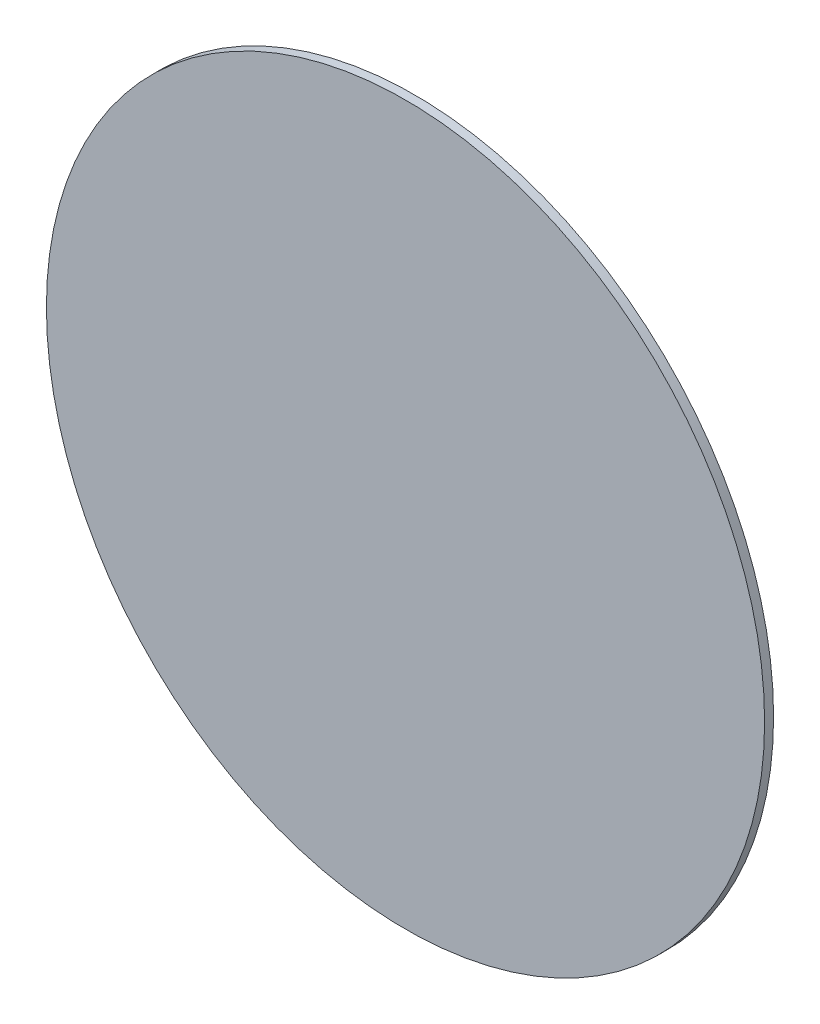
ISO-10303-21;
HEADER;
FILE_DESCRIPTION(('STEP AP214'),'2;1');
FILE_NAME('part.step','',(''),(''),'','','');
FILE_SCHEMA(('AUTOMOTIVE_DESIGN { 1 0 10303 214 1 1 1 1 }'));
ENDSEC;
DATA;
#1=APPLICATION_CONTEXT('core data for automotive mechanical design processes');
#2=APPLICATION_PROTOCOL_DEFINITION('international standard','automotive_design',2000,#1);
#3=PRODUCT_CONTEXT('',#1,'mechanical');
#4=PRODUCT('Part','Part','',(#3));
#5=PRODUCT_RELATED_PRODUCT_CATEGORY('part','',(#4));
#6=PRODUCT_DEFINITION_FORMATION('','',#4);
#7=PRODUCT_DEFINITION_CONTEXT('part definition',#1,'design');
#8=PRODUCT_DEFINITION('design','',#6,#7);
#9=PRODUCT_DEFINITION_SHAPE('','',#8);
#10=(LENGTH_UNIT() NAMED_UNIT(*) SI_UNIT(.MILLI.,.METRE.));
#11=(NAMED_UNIT(*) PLANE_ANGLE_UNIT() SI_UNIT($,.RADIAN.));
#12=(NAMED_UNIT(*) SI_UNIT($,.STERADIAN.) SOLID_ANGLE_UNIT());
#13=UNCERTAINTY_MEASURE_WITH_UNIT(LENGTH_MEASURE(1.E-05),#10,'distance_accuracy_value','');
#14=(GEOMETRIC_REPRESENTATION_CONTEXT(3) GLOBAL_UNCERTAINTY_ASSIGNED_CONTEXT((#13)) GLOBAL_UNIT_ASSIGNED_CONTEXT((#10,
#11,#12)) REPRESENTATION_CONTEXT('',''));
#15=CARTESIAN_POINT('',(0.,0.,0.));
#16=DIRECTION('',(0.,0.,1.));
#17=DIRECTION('',(1.,0.,0.));
#18=AXIS2_PLACEMENT_3D('',#15,#16,#17);
#19=CARTESIAN_POINT('',(0.,0.,0.5));
#20=DIRECTION('',(0.,0.,-1.));
#21=DIRECTION('',(-1.,0.,0.));
#22=AXIS2_PLACEMENT_3D('',#19,#20,#21);
#23=CYLINDRICAL_SURFACE('',#22,20.);
#24=CARTESIAN_POINT('',(0.,0.,0.5));
#25=DIRECTION('',(0.,0.,1.));
#26=DIRECTION('',(1.,0.,0.));
#27=AXIS2_PLACEMENT_3D('',#24,#25,#26);
#28=CIRCLE('',#27,20.);
#29=CARTESIAN_POINT('',(20.,0.,0.5));
#30=VERTEX_POINT('',#29);
#31=EDGE_CURVE('E10',#30,#30,#28,.T.);
#32=ORIENTED_EDGE('',*,*,#31,.F.);
#33=EDGE_LOOP('',(#32));
#34=FACE_BOUND('',#33,.T.);
#35=CARTESIAN_POINT('',(0.,0.,0.));
#36=DIRECTION('',(0.,0.,1.));
#37=DIRECTION('',(1.,0.,0.));
#38=AXIS2_PLACEMENT_3D('',#35,#36,#37);
#39=CIRCLE('',#38,20.);
#40=CARTESIAN_POINT('',(20.,0.,0.));
#41=VERTEX_POINT('',#40);
#42=EDGE_CURVE('E39',#41,#41,#39,.T.);
#43=ORIENTED_EDGE('',*,*,#42,.T.);
#44=EDGE_LOOP('',(#43));
#45=FACE_BOUND('',#44,.T.);
#46=ADVANCED_FACE('F36',(#34,#45),#23,.T.);
#47=CARTESIAN_POINT('',(0.,0.,0.5));
#48=DIRECTION('',(0.,0.,1.));
#49=DIRECTION('',(1.,0.,0.));
#50=AXIS2_PLACEMENT_3D('',#47,#48,#49);
#51=PLANE('',#50);
#52=ORIENTED_EDGE('',*,*,#31,.T.);
#53=EDGE_LOOP('',(#52));
#54=FACE_BOUND('',#53,.T.);
#55=ADVANCED_FACE('F53',(#54),#51,.T.);
#56=CARTESIAN_POINT('',(0.,0.,0.));
#57=DIRECTION('',(0.,0.,1.));
#58=DIRECTION('',(1.,0.,0.));
#59=AXIS2_PLACEMENT_3D('',#56,#57,#58);
#60=PLANE('',#59);
#61=ORIENTED_EDGE('',*,*,#42,.F.);
#62=EDGE_LOOP('',(#61));
#63=FACE_BOUND('',#62,.T.);
#64=ADVANCED_FACE('F51',(#63),#60,.F.);
#65=CLOSED_SHELL('',(#46,#55,#64));
#66=MANIFOLD_SOLID_BREP('B2',#65);
#67=ADVANCED_BREP_SHAPE_REPRESENTATION('',(#18,#66),#14);
#68=SHAPE_DEFINITION_REPRESENTATION(#9,#67);
ENDSEC;
END-ISO-10303-21;
